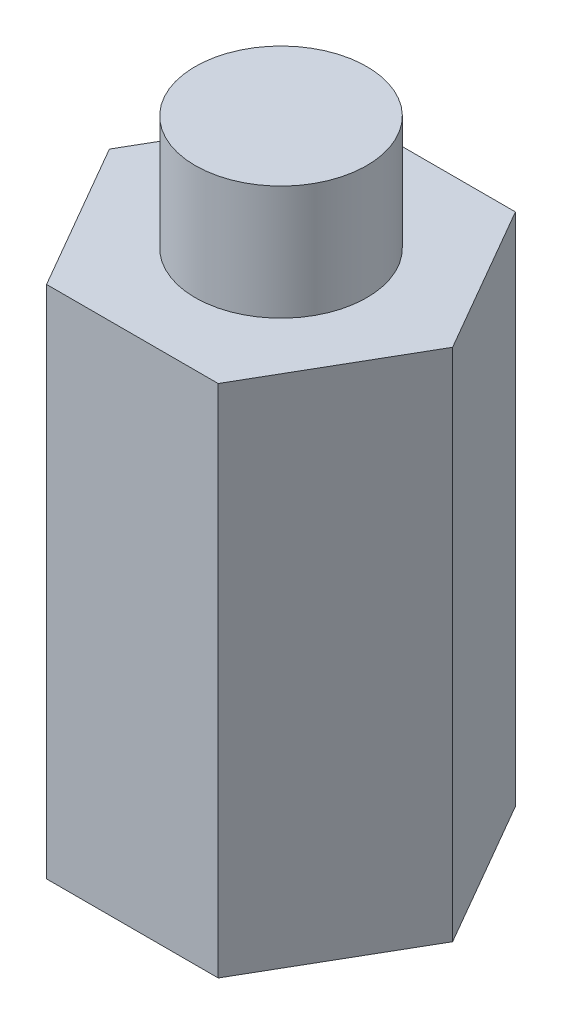
ISO-10303-21;
HEADER;
FILE_DESCRIPTION(('STEP AP214'),'2;1');
FILE_NAME('part.step','',(''),(''),'','','');
FILE_SCHEMA(('AUTOMOTIVE_DESIGN { 1 0 10303 214 1 1 1 1 }'));
ENDSEC;
DATA;
#1=APPLICATION_CONTEXT('core data for automotive mechanical design processes');
#2=APPLICATION_PROTOCOL_DEFINITION('international standard','automotive_design',2000,#1);
#3=PRODUCT_CONTEXT('',#1,'mechanical');
#4=PRODUCT('Part','Part','',(#3));
#5=PRODUCT_RELATED_PRODUCT_CATEGORY('part','',(#4));
#6=PRODUCT_DEFINITION_FORMATION('','',#4);
#7=PRODUCT_DEFINITION_CONTEXT('part definition',#1,'design');
#8=PRODUCT_DEFINITION('design','',#6,#7);
#9=PRODUCT_DEFINITION_SHAPE('','',#8);
#10=(LENGTH_UNIT() NAMED_UNIT(*) SI_UNIT(.MILLI.,.METRE.));
#11=(NAMED_UNIT(*) PLANE_ANGLE_UNIT() SI_UNIT($,.RADIAN.));
#12=(NAMED_UNIT(*) SI_UNIT($,.STERADIAN.) SOLID_ANGLE_UNIT());
#13=UNCERTAINTY_MEASURE_WITH_UNIT(LENGTH_MEASURE(1.E-05),#10,'distance_accuracy_value','');
#14=(GEOMETRIC_REPRESENTATION_CONTEXT(3) GLOBAL_UNCERTAINTY_ASSIGNED_CONTEXT((#13)) GLOBAL_UNIT_ASSIGNED_CONTEXT((#10,
#11,#12)) REPRESENTATION_CONTEXT('',''));
#15=CARTESIAN_POINT('',(0.,0.,0.));
#16=DIRECTION('',(0.,0.,1.));
#17=DIRECTION('',(1.,0.,0.));
#18=AXIS2_PLACEMENT_3D('',#15,#16,#17);
#19=CARTESIAN_POINT('',(0.,9.,0.));
#20=DIRECTION('',(0.,-1.,0.));
#21=DIRECTION('',(0.,0.,-1.));
#22=AXIS2_PLACEMENT_3D('',#19,#20,#21);
#23=CYLINDRICAL_SURFACE('',#22,1.5);
#24=CARTESIAN_POINT('',(0.,0.,0.));
#25=DIRECTION('',(0.,1.,0.));
#26=DIRECTION('',(0.,0.,1.));
#27=AXIS2_PLACEMENT_3D('',#24,#25,#26);
#28=CIRCLE('',#27,1.5);
#29=CARTESIAN_POINT('',(0.,0.,1.5));
#30=VERTEX_POINT('',#29);
#31=EDGE_CURVE('E262',#30,#30,#28,.T.);
#32=ORIENTED_EDGE('',*,*,#31,.F.);
#33=EDGE_LOOP('',(#32));
#34=FACE_BOUND('',#33,.T.);
#35=CARTESIAN_POINT('',(0.,8.,0.));
#36=DIRECTION('',(0.,1.,0.));
#37=DIRECTION('',(0.,0.,1.));
#38=AXIS2_PLACEMENT_3D('',#35,#36,#37);
#39=CIRCLE('',#38,1.5);
#40=CARTESIAN_POINT('',(0.,8.,1.5));
#41=VERTEX_POINT('',#40);
#42=EDGE_CURVE('E258',#41,#41,#39,.T.);
#43=ORIENTED_EDGE('',*,*,#42,.T.);
#44=EDGE_LOOP('',(#43));
#45=FACE_BOUND('',#44,.T.);
#46=ADVANCED_FACE('F45',(#34,#45),#23,.F.);
#47=CARTESIAN_POINT('',(0.,9.,0.));
#48=DIRECTION('',(0.,1.,0.));
#49=DIRECTION('',(0.,0.,1.));
#50=AXIS2_PLACEMENT_3D('',#47,#48,#49);
#51=PLANE('',#50);
#52=DIRECTION('',(0.5,0.,-0.866025403784439));
#53=VECTOR('',#52,1.);
#54=CARTESIAN_POINT('',(1.5,9.,2.59807621135332));
#55=LINE('',#54,#53);
#56=CARTESIAN_POINT('',(1.5,9.,2.59807621135332));
#57=VERTEX_POINT('',#56);
#58=CARTESIAN_POINT('',(3.,9.,0.));
#59=VERTEX_POINT('',#58);
#60=EDGE_CURVE('E153',#57,#59,#55,.T.);
#61=ORIENTED_EDGE('',*,*,#60,.T.);
#62=DIRECTION('',(-0.5,0.,-0.866025403784438));
#63=VECTOR('',#62,1.);
#64=CARTESIAN_POINT('',(3.,9.,0.));
#65=LINE('',#64,#63);
#66=CARTESIAN_POINT('',(1.5,9.,-2.59807621135331));
#67=VERTEX_POINT('',#66);
#68=EDGE_CURVE('E100',#59,#67,#65,.T.);
#69=ORIENTED_EDGE('',*,*,#68,.T.);
#70=DIRECTION('',(-1.,0.,0.));
#71=VECTOR('',#70,1.);
#72=CARTESIAN_POINT('',(1.5,9.,-2.59807621135331));
#73=LINE('',#72,#71);
#74=CARTESIAN_POINT('',(-1.5,9.,-2.59807621135332));
#75=VERTEX_POINT('',#74);
#76=EDGE_CURVE('E114',#67,#75,#73,.T.);
#77=ORIENTED_EDGE('',*,*,#76,.T.);
#78=DIRECTION('',(-0.5,0.,0.866025403784439));
#79=VECTOR('',#78,1.);
#80=CARTESIAN_POINT('',(-1.5,9.,-2.59807621135332));
#81=LINE('',#80,#79);
#82=CARTESIAN_POINT('',(-3.,9.,0.));
#83=VERTEX_POINT('',#82);
#84=EDGE_CURVE('E107',#75,#83,#81,.T.);
#85=ORIENTED_EDGE('',*,*,#84,.T.);
#86=DIRECTION('',(0.5,0.,0.866025403784439));
#87=VECTOR('',#86,1.);
#88=CARTESIAN_POINT('',(-3.,9.,0.));
#89=LINE('',#88,#87);
#90=CARTESIAN_POINT('',(-1.5,9.,2.59807621135332));
#91=VERTEX_POINT('',#90);
#92=EDGE_CURVE('E112',#83,#91,#89,.T.);
#93=ORIENTED_EDGE('',*,*,#92,.T.);
#94=DIRECTION('',(1.,0.,0.));
#95=VECTOR('',#94,1.);
#96=CARTESIAN_POINT('',(-1.5,9.,2.59807621135332));
#97=LINE('',#96,#95);
#98=EDGE_CURVE('E63',#91,#57,#97,.T.);
#99=ORIENTED_EDGE('',*,*,#98,.T.);
#100=EDGE_LOOP('',(#61,#69,#77,#85,#93,#99));
#101=FACE_BOUND('',#100,.T.);
#102=CARTESIAN_POINT('',(0.,9.,0.));
#103=DIRECTION('',(0.,1.,0.));
#104=DIRECTION('',(0.,0.,1.));
#105=AXIS2_PLACEMENT_3D('',#102,#103,#104);
#106=CIRCLE('',#105,1.5);
#107=CARTESIAN_POINT('',(0.,9.,1.5));
#108=VERTEX_POINT('',#107);
#109=EDGE_CURVE('E141',#108,#108,#106,.T.);
#110=ORIENTED_EDGE('',*,*,#109,.F.);
#111=EDGE_LOOP('',(#110));
#112=FACE_BOUND('',#111,.T.);
#113=ADVANCED_FACE('F109',(#101,#112),#51,.T.);
#114=CARTESIAN_POINT('',(0.,0.,0.));
#115=DIRECTION('',(0.,1.,0.));
#116=DIRECTION('',(0.,0.,1.));
#117=AXIS2_PLACEMENT_3D('',#114,#115,#116);
#118=PLANE('',#117);
#119=DIRECTION('',(0.5,0.,-0.866025403784439));
#120=VECTOR('',#119,1.);
#121=CARTESIAN_POINT('',(1.5,0.,2.59807621135332));
#122=LINE('',#121,#120);
#123=CARTESIAN_POINT('',(1.5,0.,2.59807621135332));
#124=VERTEX_POINT('',#123);
#125=CARTESIAN_POINT('',(3.,0.,0.));
#126=VERTEX_POINT('',#125);
#127=EDGE_CURVE('E136',#124,#126,#122,.T.);
#128=ORIENTED_EDGE('',*,*,#127,.F.);
#129=DIRECTION('',(1.,0.,0.));
#130=VECTOR('',#129,1.);
#131=CARTESIAN_POINT('',(-1.5,0.,2.59807621135332));
#132=LINE('',#131,#130);
#133=CARTESIAN_POINT('',(-1.5,0.,2.59807621135332));
#134=VERTEX_POINT('',#133);
#135=EDGE_CURVE('E92',#134,#124,#132,.T.);
#136=ORIENTED_EDGE('',*,*,#135,.F.);
#137=DIRECTION('',(0.5,0.,0.866025403784439));
#138=VECTOR('',#137,1.);
#139=CARTESIAN_POINT('',(-3.,0.,0.));
#140=LINE('',#139,#138);
#141=CARTESIAN_POINT('',(-3.,0.,0.));
#142=VERTEX_POINT('',#141);
#143=EDGE_CURVE('E86',#142,#134,#140,.T.);
#144=ORIENTED_EDGE('',*,*,#143,.F.);
#145=DIRECTION('',(-0.5,0.,0.866025403784439));
#146=VECTOR('',#145,1.);
#147=CARTESIAN_POINT('',(-1.5,0.,-2.59807621135332));
#148=LINE('',#147,#146);
#149=CARTESIAN_POINT('',(-1.5,0.,-2.59807621135332));
#150=VERTEX_POINT('',#149);
#151=EDGE_CURVE('E123',#150,#142,#148,.T.);
#152=ORIENTED_EDGE('',*,*,#151,.F.);
#153=DIRECTION('',(-1.,0.,0.));
#154=VECTOR('',#153,1.);
#155=CARTESIAN_POINT('',(1.5,0.,-2.59807621135331));
#156=LINE('',#155,#154);
#157=CARTESIAN_POINT('',(1.5,0.,-2.59807621135331));
#158=VERTEX_POINT('',#157);
#159=EDGE_CURVE('E144',#158,#150,#156,.T.);
#160=ORIENTED_EDGE('',*,*,#159,.F.);
#161=DIRECTION('',(-0.5,0.,-0.866025403784438));
#162=VECTOR('',#161,1.);
#163=CARTESIAN_POINT('',(3.,0.,0.));
#164=LINE('',#163,#162);
#165=EDGE_CURVE('E140',#126,#158,#164,.T.);
#166=ORIENTED_EDGE('',*,*,#165,.F.);
#167=EDGE_LOOP('',(#128,#136,#144,#152,#160,#166));
#168=FACE_BOUND('',#167,.T.);
#169=ORIENTED_EDGE('',*,*,#31,.T.);
#170=EDGE_LOOP('',(#169));
#171=FACE_BOUND('',#170,.T.);
#172=ADVANCED_FACE('F166',(#168,#171),#118,.F.);
#173=CARTESIAN_POINT('',(1.5,9.,2.59807621135332));
#174=DIRECTION('',(-0.866025403784439,0.,-0.499999999999999));
#175=DIRECTION('',(-0.5,0.,0.866025403784439));
#176=AXIS2_PLACEMENT_3D('',#173,#174,#175);
#177=PLANE('',#176);
#178=ORIENTED_EDGE('',*,*,#127,.T.);
#179=DIRECTION('',(0.,-1.,0.));
#180=VECTOR('',#179,1.);
#181=CARTESIAN_POINT('',(3.,9.,0.));
#182=LINE('',#181,#180);
#183=EDGE_CURVE('E11',#59,#126,#182,.T.);
#184=ORIENTED_EDGE('',*,*,#183,.F.);
#185=ORIENTED_EDGE('',*,*,#60,.F.);
#186=DIRECTION('',(0.,-1.,0.));
#187=VECTOR('',#186,1.);
#188=CARTESIAN_POINT('',(1.5,9.,2.59807621135332));
#189=LINE('',#188,#187);
#190=EDGE_CURVE('E132',#57,#124,#189,.T.);
#191=ORIENTED_EDGE('',*,*,#190,.T.);
#192=EDGE_LOOP('',(#178,#184,#185,#191));
#193=FACE_BOUND('',#192,.T.);
#194=ADVANCED_FACE('F47',(#193),#177,.F.);
#195=CARTESIAN_POINT('',(3.,9.,0.));
#196=DIRECTION('',(-0.866025403784438,0.,0.5));
#197=DIRECTION('',(0.5,0.,0.866025403784439));
#198=AXIS2_PLACEMENT_3D('',#195,#196,#197);
#199=PLANE('',#198);
#200=ORIENTED_EDGE('',*,*,#165,.T.);
#201=DIRECTION('',(0.,-1.,0.));
#202=VECTOR('',#201,1.);
#203=CARTESIAN_POINT('',(1.5,9.,-2.59807621135331));
#204=LINE('',#203,#202);
#205=EDGE_CURVE('E55',#67,#158,#204,.T.);
#206=ORIENTED_EDGE('',*,*,#205,.F.);
#207=ORIENTED_EDGE('',*,*,#68,.F.);
#208=ORIENTED_EDGE('',*,*,#183,.T.);
#209=EDGE_LOOP('',(#200,#206,#207,#208));
#210=FACE_BOUND('',#209,.T.);
#211=ADVANCED_FACE('F198',(#210),#199,.F.);
#212=CARTESIAN_POINT('',(1.5,9.,-2.59807621135331));
#213=DIRECTION('',(0.,0.,1.));
#214=DIRECTION('',(1.,0.,0.));
#215=AXIS2_PLACEMENT_3D('',#212,#213,#214);
#216=PLANE('',#215);
#217=ORIENTED_EDGE('',*,*,#159,.T.);
#218=DIRECTION('',(0.,-1.,0.));
#219=VECTOR('',#218,1.);
#220=CARTESIAN_POINT('',(-1.5,9.,-2.59807621135332));
#221=LINE('',#220,#219);
#222=EDGE_CURVE('E125',#75,#150,#221,.T.);
#223=ORIENTED_EDGE('',*,*,#222,.F.);
#224=ORIENTED_EDGE('',*,*,#76,.F.);
#225=ORIENTED_EDGE('',*,*,#205,.T.);
#226=EDGE_LOOP('',(#217,#223,#224,#225));
#227=FACE_BOUND('',#226,.T.);
#228=ADVANCED_FACE('F163',(#227),#216,.F.);
#229=CARTESIAN_POINT('',(-1.5,9.,-2.59807621135332));
#230=DIRECTION('',(0.866025403784439,0.,0.5));
#231=DIRECTION('',(0.5,0.,-0.866025403784439));
#232=AXIS2_PLACEMENT_3D('',#229,#230,#231);
#233=PLANE('',#232);
#234=ORIENTED_EDGE('',*,*,#151,.T.);
#235=DIRECTION('',(0.,-1.,0.));
#236=VECTOR('',#235,1.);
#237=CARTESIAN_POINT('',(-3.,9.,0.));
#238=LINE('',#237,#236);
#239=EDGE_CURVE('E120',#83,#142,#238,.T.);
#240=ORIENTED_EDGE('',*,*,#239,.F.);
#241=ORIENTED_EDGE('',*,*,#84,.F.);
#242=ORIENTED_EDGE('',*,*,#222,.T.);
#243=EDGE_LOOP('',(#234,#240,#241,#242));
#244=FACE_BOUND('',#243,.T.);
#245=ADVANCED_FACE('F121',(#244),#233,.F.);
#246=CARTESIAN_POINT('',(-3.,9.,0.));
#247=DIRECTION('',(0.866025403784438,0.,-0.5));
#248=DIRECTION('',(-0.5,0.,-0.866025403784439));
#249=AXIS2_PLACEMENT_3D('',#246,#247,#248);
#250=PLANE('',#249);
#251=ORIENTED_EDGE('',*,*,#143,.T.);
#252=DIRECTION('',(0.,-1.,0.));
#253=VECTOR('',#252,1.);
#254=CARTESIAN_POINT('',(-1.5,9.,2.59807621135332));
#255=LINE('',#254,#253);
#256=EDGE_CURVE('E126',#91,#134,#255,.T.);
#257=ORIENTED_EDGE('',*,*,#256,.F.);
#258=ORIENTED_EDGE('',*,*,#92,.F.);
#259=ORIENTED_EDGE('',*,*,#239,.T.);
#260=EDGE_LOOP('',(#251,#257,#258,#259));
#261=FACE_BOUND('',#260,.T.);
#262=ADVANCED_FACE('F128',(#261),#250,.F.);
#263=CARTESIAN_POINT('',(-1.5,9.,2.59807621135332));
#264=DIRECTION('',(0.,0.,-1.));
#265=DIRECTION('',(-1.,0.,0.));
#266=AXIS2_PLACEMENT_3D('',#263,#264,#265);
#267=PLANE('',#266);
#268=ORIENTED_EDGE('',*,*,#135,.T.);
#269=ORIENTED_EDGE('',*,*,#190,.F.);
#270=ORIENTED_EDGE('',*,*,#98,.F.);
#271=ORIENTED_EDGE('',*,*,#256,.T.);
#272=EDGE_LOOP('',(#268,#269,#270,#271));
#273=FACE_BOUND('',#272,.T.);
#274=ADVANCED_FACE('F171',(#273),#267,.F.);
#275=CARTESIAN_POINT('',(0.,8.,0.));
#276=DIRECTION('',(0.,1.,0.));
#277=DIRECTION('',(0.,0.,1.));
#278=AXIS2_PLACEMENT_3D('',#275,#276,#277);
#279=PLANE('',#278);
#280=ORIENTED_EDGE('',*,*,#42,.F.);
#281=EDGE_LOOP('',(#280));
#282=FACE_BOUND('',#281,.T.);
#283=ADVANCED_FACE('F173',(#282),#279,.F.);
#284=CARTESIAN_POINT('',(0.,8.,0.));
#285=DIRECTION('',(0.,1.,0.));
#286=DIRECTION('',(0.,0.,1.));
#287=AXIS2_PLACEMENT_3D('',#284,#285,#286);
#288=CYLINDRICAL_SURFACE('',#287,1.5);
#289=ORIENTED_EDGE('',*,*,#109,.T.);
#290=EDGE_LOOP('',(#289));
#291=FACE_BOUND('',#290,.T.);
#292=CARTESIAN_POINT('',(0.,11.,0.));
#293=DIRECTION('',(0.,1.,0.));
#294=DIRECTION('',(0.,0.,1.));
#295=AXIS2_PLACEMENT_3D('',#292,#293,#294);
#296=CIRCLE('',#295,1.5);
#297=CARTESIAN_POINT('',(0.,11.,1.5));
#298=VERTEX_POINT('',#297);
#299=EDGE_CURVE('E255',#298,#298,#296,.T.);
#300=ORIENTED_EDGE('',*,*,#299,.F.);
#301=EDGE_LOOP('',(#300));
#302=FACE_BOUND('',#301,.T.);
#303=ADVANCED_FACE('F180',(#291,#302),#288,.T.);
#304=CARTESIAN_POINT('',(0.,11.,0.));
#305=DIRECTION('',(0.,1.,0.));
#306=DIRECTION('',(0.,0.,1.));
#307=AXIS2_PLACEMENT_3D('',#304,#305,#306);
#308=PLANE('',#307);
#309=ORIENTED_EDGE('',*,*,#299,.T.);
#310=EDGE_LOOP('',(#309));
#311=FACE_BOUND('',#310,.T.);
#312=ADVANCED_FACE('F241',(#311),#308,.T.);
#313=CLOSED_SHELL('',(#46,#113,#172,#194,#211,#228,#245,#262,#274,#283,#303,#312));
#314=MANIFOLD_SOLID_BREP('B2',#313);
#315=ADVANCED_BREP_SHAPE_REPRESENTATION('',(#18,#314),#14);
#316=SHAPE_DEFINITION_REPRESENTATION(#9,#315);
ENDSEC;
END-ISO-10303-21;
